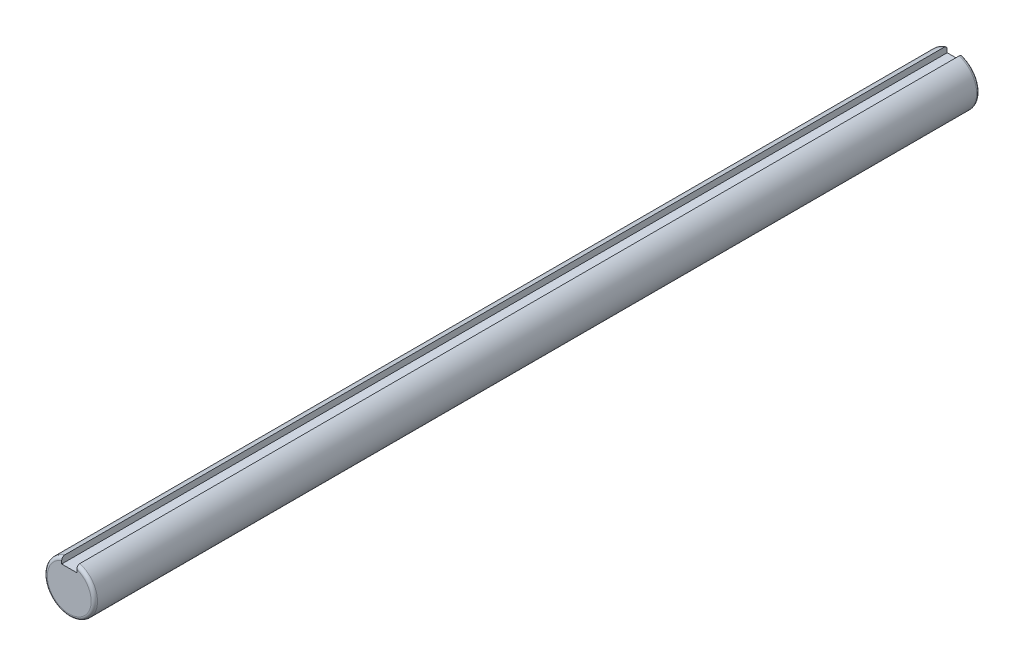
ISO-10303-21;
HEADER;
FILE_DESCRIPTION(('STEP AP214'),'2;1');
FILE_NAME('part.step','',(''),(''),'','','');
FILE_SCHEMA(('AUTOMOTIVE_DESIGN { 1 0 10303 214 1 1 1 1 }'));
ENDSEC;
DATA;
#1=APPLICATION_CONTEXT('core data for automotive mechanical design processes');
#2=APPLICATION_PROTOCOL_DEFINITION('international standard','automotive_design',2000,#1);
#3=PRODUCT_CONTEXT('',#1,'mechanical');
#4=PRODUCT('Part','Part','',(#3));
#5=PRODUCT_RELATED_PRODUCT_CATEGORY('part','',(#4));
#6=PRODUCT_DEFINITION_FORMATION('','',#4);
#7=PRODUCT_DEFINITION_CONTEXT('part definition',#1,'design');
#8=PRODUCT_DEFINITION('design','',#6,#7);
#9=PRODUCT_DEFINITION_SHAPE('','',#8);
#10=(LENGTH_UNIT() NAMED_UNIT(*) SI_UNIT(.MILLI.,.METRE.));
#11=(NAMED_UNIT(*) PLANE_ANGLE_UNIT() SI_UNIT($,.RADIAN.));
#12=(NAMED_UNIT(*) SI_UNIT($,.STERADIAN.) SOLID_ANGLE_UNIT());
#13=UNCERTAINTY_MEASURE_WITH_UNIT(LENGTH_MEASURE(1.E-05),#10,'distance_accuracy_value','');
#14=(GEOMETRIC_REPRESENTATION_CONTEXT(3) GLOBAL_UNCERTAINTY_ASSIGNED_CONTEXT((#13)) GLOBAL_UNIT_ASSIGNED_CONTEXT((#10,
#11,#12)) REPRESENTATION_CONTEXT('',''));
#15=CARTESIAN_POINT('',(0.,0.,0.));
#16=DIRECTION('',(0.,0.,1.));
#17=DIRECTION('',(1.,0.,0.));
#18=AXIS2_PLACEMENT_3D('',#15,#16,#17);
#19=CARTESIAN_POINT('',(0.,0.,140.));
#20=DIRECTION('',(0.,0.,-1.));
#21=DIRECTION('',(-1.,0.,0.));
#22=AXIS2_PLACEMENT_3D('',#19,#20,#21);
#23=CYLINDRICAL_SURFACE('',#22,3.96875);
#24=DIRECTION('',(0.,0.,-1.));
#25=VECTOR('',#24,1.);
#26=CARTESIAN_POINT('',(-1.190625,3.7859462056235,140.));
#27=LINE('',#26,#25);
#28=CARTESIAN_POINT('',(-1.190625,3.7859462056235,139.5));
#29=VERTEX_POINT('',#28);
#30=CARTESIAN_POINT('',(-1.190625,3.7859462056235,0.5));
#31=VERTEX_POINT('',#30);
#32=EDGE_CURVE('E117',#29,#31,#27,.T.);
#33=ORIENTED_EDGE('',*,*,#32,.T.);
#34=CARTESIAN_POINT('',(0.,0.,0.5));
#35=DIRECTION('',(0.,0.,1.));
#36=DIRECTION('',(1.,0.,0.));
#37=AXIS2_PLACEMENT_3D('',#34,#35,#36);
#38=CIRCLE('',#37,3.96875);
#39=CARTESIAN_POINT('',(1.190625,3.7859462056235,0.5));
#40=VERTEX_POINT('',#39);
#41=EDGE_CURVE('E127',#31,#40,#38,.T.);
#42=ORIENTED_EDGE('',*,*,#41,.T.);
#43=DIRECTION('',(0.,0.,-1.));
#44=VECTOR('',#43,1.);
#45=CARTESIAN_POINT('',(1.190625,3.7859462056235,140.));
#46=LINE('',#45,#44);
#47=CARTESIAN_POINT('',(1.190625,3.7859462056235,139.5));
#48=VERTEX_POINT('',#47);
#49=EDGE_CURVE('E121',#40,#48,#46,.F.);
#50=ORIENTED_EDGE('',*,*,#49,.T.);
#51=CARTESIAN_POINT('',(0.,0.,139.5));
#52=DIRECTION('',(0.,0.,1.));
#53=DIRECTION('',(1.,0.,0.));
#54=AXIS2_PLACEMENT_3D('',#51,#52,#53);
#55=CIRCLE('',#54,3.96875);
#56=EDGE_CURVE('E125',#48,#29,#55,.F.);
#57=ORIENTED_EDGE('',*,*,#56,.T.);
#58=EDGE_LOOP('',(#33,#42,#50,#57));
#59=FACE_BOUND('',#58,.T.);
#60=ADVANCED_FACE('F32',(#59),#23,.T.);
#61=CARTESIAN_POINT('',(0.,0.,140.));
#62=DIRECTION('',(0.,0.,1.));
#63=DIRECTION('',(1.,0.,0.));
#64=AXIS2_PLACEMENT_3D('',#61,#62,#63);
#65=PLANE('',#64);
#66=DIRECTION('',(0.,1.,0.));
#67=VECTOR('',#66,1.);
#68=CARTESIAN_POINT('',(-1.190625,3.96875,140.));
#69=LINE('',#68,#67);
#70=CARTESIAN_POINT('',(-1.190625,2.778125,140.));
#71=VERTEX_POINT('',#70);
#72=CARTESIAN_POINT('',(-1.190625,3.25801145975195,140.));
#73=VERTEX_POINT('',#72);
#74=EDGE_CURVE('E108',#71,#73,#69,.T.);
#75=ORIENTED_EDGE('',*,*,#74,.T.);
#76=CARTESIAN_POINT('',(0.,0.,140.));
#77=DIRECTION('',(0.,0.,1.));
#78=DIRECTION('',(1.,0.,0.));
#79=AXIS2_PLACEMENT_3D('',#76,#77,#78);
#80=CIRCLE('',#79,3.46875);
#81=CARTESIAN_POINT('',(1.190625,3.25801145975195,140.));
#82=VERTEX_POINT('',#81);
#83=EDGE_CURVE('E11',#73,#82,#80,.T.);
#84=ORIENTED_EDGE('',*,*,#83,.T.);
#85=DIRECTION('',(0.,-1.,0.));
#86=VECTOR('',#85,1.);
#87=CARTESIAN_POINT('',(1.190625,3.96875,140.));
#88=LINE('',#87,#86);
#89=CARTESIAN_POINT('',(1.190625,2.778125,140.));
#90=VERTEX_POINT('',#89);
#91=EDGE_CURVE('E90',#82,#90,#88,.T.);
#92=ORIENTED_EDGE('',*,*,#91,.T.);
#93=DIRECTION('',(-1.,0.,0.));
#94=VECTOR('',#93,1.);
#95=CARTESIAN_POINT('',(1.190625,2.778125,140.));
#96=LINE('',#95,#94);
#97=EDGE_CURVE('E94',#90,#71,#96,.T.);
#98=ORIENTED_EDGE('',*,*,#97,.T.);
#99=EDGE_LOOP('',(#75,#84,#92,#98));
#100=FACE_BOUND('',#99,.T.);
#101=ADVANCED_FACE('F92',(#100),#65,.T.);
#102=CARTESIAN_POINT('',(0.,0.,0.));
#103=DIRECTION('',(0.,0.,1.));
#104=DIRECTION('',(1.,0.,0.));
#105=AXIS2_PLACEMENT_3D('',#102,#103,#104);
#106=PLANE('',#105);
#107=DIRECTION('',(0.,1.,0.));
#108=VECTOR('',#107,1.);
#109=CARTESIAN_POINT('',(1.190625,0.,0.));
#110=LINE('',#109,#108);
#111=CARTESIAN_POINT('',(1.190625,2.778125,0.));
#112=VERTEX_POINT('',#111);
#113=CARTESIAN_POINT('',(1.190625,3.25801145975195,0.));
#114=VERTEX_POINT('',#113);
#115=EDGE_CURVE('E103',#112,#114,#110,.T.);
#116=ORIENTED_EDGE('',*,*,#115,.T.);
#117=CARTESIAN_POINT('',(0.,0.,0.));
#118=DIRECTION('',(0.,0.,1.));
#119=DIRECTION('',(1.,0.,0.));
#120=AXIS2_PLACEMENT_3D('',#117,#118,#119);
#121=CIRCLE('',#120,3.46875);
#122=CARTESIAN_POINT('',(-1.190625,3.25801145975195,0.));
#123=VERTEX_POINT('',#122);
#124=EDGE_CURVE('E56',#114,#123,#121,.F.);
#125=ORIENTED_EDGE('',*,*,#124,.T.);
#126=DIRECTION('',(0.,1.,0.));
#127=VECTOR('',#126,1.);
#128=CARTESIAN_POINT('',(-1.190625,3.96875,0.));
#129=LINE('',#128,#127);
#130=CARTESIAN_POINT('',(-1.190625,2.778125,0.));
#131=VERTEX_POINT('',#130);
#132=EDGE_CURVE('E97',#131,#123,#129,.T.);
#133=ORIENTED_EDGE('',*,*,#132,.F.);
#134=DIRECTION('',(-1.,0.,0.));
#135=VECTOR('',#134,1.);
#136=CARTESIAN_POINT('',(1.190625,2.778125,0.));
#137=LINE('',#136,#135);
#138=EDGE_CURVE('E114',#112,#131,#137,.T.);
#139=ORIENTED_EDGE('',*,*,#138,.F.);
#140=EDGE_LOOP('',(#116,#125,#133,#139));
#141=FACE_BOUND('',#140,.T.);
#142=ADVANCED_FACE('F148',(#141),#106,.F.);
#143=CARTESIAN_POINT('',(1.190625,3.96875,140.));
#144=DIRECTION('',(1.,0.,0.));
#145=DIRECTION('',(0.,1.,0.));
#146=AXIS2_PLACEMENT_3D('',#143,#144,#145);
#147=PLANE('',#146);
#148=ORIENTED_EDGE('',*,*,#49,.F.);
#149=CARTESIAN_POINT('',(1.190625,3.7859462056235,0.5));
#150=CARTESIAN_POINT('',(1.190625,3.78597469873176,0.472841635279006));
#151=CARTESIAN_POINT('',(1.190625,3.78362855501618,0.445697062864998));
#152=CARTESIAN_POINT('',(1.190625,3.7744051521155,0.392241759160536));
#153=CARTESIAN_POINT('',(1.190625,3.76753680609938,0.36592949410861));
#154=CARTESIAN_POINT('',(1.190625,3.74948488408156,0.314830355920039));
#155=CARTESIAN_POINT('',(1.190625,3.73830096098876,0.290043605662712));
#156=CARTESIAN_POINT('',(1.190625,3.71200275021313,0.24265264138581));
#157=CARTESIAN_POINT('',(1.190625,3.69688786184004,0.220048761654929));
#158=CARTESIAN_POINT('',(1.190625,3.66290573586547,0.17720400705749));
#159=CARTESIAN_POINT('',(1.190625,3.64397635012101,0.157012498790457));
#160=CARTESIAN_POINT('',(1.190625,3.60312304377105,0.119931609671898));
#161=CARTESIAN_POINT('',(1.190625,3.58119853810037,0.103042875553714));
#162=CARTESIAN_POINT('',(1.190625,3.53396255652632,0.0722472941472065));
#163=CARTESIAN_POINT('',(1.190625,3.50854463358824,0.0585039369932241));
#164=CARTESIAN_POINT('',(1.190625,3.45583959675433,0.0352408202070888));
#165=CARTESIAN_POINT('',(1.190625,3.42855198463452,0.0257221914486862));
#166=CARTESIAN_POINT('',(1.190625,3.3774241577984,0.0122602444725575));
#167=CARTESIAN_POINT('',(1.190625,3.35375426435924,0.00765780294128063));
#168=CARTESIAN_POINT('',(1.190625,3.30606001214181,0.00152765636510467));
#169=CARTESIAN_POINT('',(1.190625,3.28203632691435,-5.28038605039217E-06));
#170=CARTESIAN_POINT('',(1.190625,3.25801145975195,0.));
#171=B_SPLINE_CURVE_WITH_KNOTS('',3,(#149,#150,#151,#152,#153,#154,#155,#156,#157,#158,#159,
#160,#161,#162,#163,#164,#165,#166,#167,#168,#169,#170),.UNSPECIFIED.,.F.,.F.,(4,2,2,2,2,2,2,2,
2,2,4),(0.,0.081352909992497,0.162545953129706,0.243745527782305,0.324957517828655,
0.407618753958614,0.490296160242253,0.57660379286383,0.662934514368061,0.735079323221441,
0.80710106244285),.UNSPECIFIED.);
#172=EDGE_CURVE('E137',#40,#114,#171,.T.);
#173=ORIENTED_EDGE('',*,*,#172,.T.);
#174=ORIENTED_EDGE('',*,*,#115,.F.);
#175=DIRECTION('',(0.,0.,-1.));
#176=VECTOR('',#175,1.);
#177=CARTESIAN_POINT('',(1.190625,2.778125,140.));
#178=LINE('',#177,#176);
#179=EDGE_CURVE('E100',#90,#112,#178,.T.);
#180=ORIENTED_EDGE('',*,*,#179,.F.);
#181=ORIENTED_EDGE('',*,*,#91,.F.);
#182=CARTESIAN_POINT('',(1.190625,3.25801145975195,140.));
#183=CARTESIAN_POINT('',(1.190625,3.28907992168964,140.000019965846));
#184=CARTESIAN_POINT('',(1.190625,3.32015960922475,139.997446071046));
#185=CARTESIAN_POINT('',(1.190625,3.38150594471072,139.987184562257));
#186=CARTESIAN_POINT('',(1.190625,3.41177139473099,139.979489801146));
#187=CARTESIAN_POINT('',(1.190625,3.47060505161755,139.959045969103));
#188=CARTESIAN_POINT('',(1.190625,3.4991707040308,139.946289501569));
#189=CARTESIAN_POINT('',(1.190625,3.55361697804484,139.91598874355));
#190=CARTESIAN_POINT('',(1.190625,3.57949995574897,139.898448704341));
#191=CARTESIAN_POINT('',(1.190625,3.62679543148133,139.859740811631));
#192=CARTESIAN_POINT('',(1.190625,3.64833897408505,139.838733275455));
#193=CARTESIAN_POINT('',(1.190625,3.68736058817001,139.793213377799));
#194=CARTESIAN_POINT('',(1.190625,3.70483831240646,139.768700717248));
#195=CARTESIAN_POINT('',(1.190625,3.73425592210001,139.718268937998));
#196=CARTESIAN_POINT('',(1.190625,3.74643788156944,139.692490695877));
#197=CARTESIAN_POINT('',(1.190625,3.76608393875365,139.63921138492));
#198=CARTESIAN_POINT('',(1.190625,3.77355430857205,139.611712660267));
#199=CARTESIAN_POINT('',(1.190625,3.78099893838195,139.569963151131));
#200=CARTESIAN_POINT('',(1.190625,3.78285363458437,139.556024411405));
#201=CARTESIAN_POINT('',(1.190625,3.78532637941045,139.52805951352));
#202=CARTESIAN_POINT('',(1.190625,3.78594634465496,139.514033524801));
#203=CARTESIAN_POINT('',(1.190625,3.78594620562375,139.5));
#204=B_SPLINE_CURVE_WITH_KNOTS('',3,(#182,#183,#184,#185,#186,#187,#188,#189,#190,#191,#192,
#193,#194,#195,#196,#197,#198,#199,#200,#201,#202,#203),.UNSPECIFIED.,.F.,.F.,(4,2,2,2,2,2,2,2,
2,2,4),(0.,0.0931172239102765,0.1863646835369,0.279748909171464,0.37305041091707,
0.462860495660882,0.55267824790015,0.637792435916784,0.722793078799524,0.764930556360932,
0.807002574553209),.UNSPECIFIED.);
#205=EDGE_CURVE('E130',#82,#48,#204,.T.);
#206=ORIENTED_EDGE('',*,*,#205,.T.);
#207=EDGE_LOOP('',(#148,#173,#174,#180,#181,#206));
#208=FACE_BOUND('',#207,.T.);
#209=ADVANCED_FACE('F102',(#208),#147,.F.);
#210=CARTESIAN_POINT('',(-1.190625,3.96875,140.));
#211=DIRECTION('',(-1.,0.,0.));
#212=DIRECTION('',(0.,-1.,0.));
#213=AXIS2_PLACEMENT_3D('',#210,#211,#212);
#214=PLANE('',#213);
#215=ORIENTED_EDGE('',*,*,#132,.T.);
#216=CARTESIAN_POINT('',(-1.190625,3.25801145975195,0.));
#217=CARTESIAN_POINT('',(-1.190625,3.28907992168963,-1.99658462172724E-05));
#218=CARTESIAN_POINT('',(-1.190625,3.32015960922475,0.00255392895355367));
#219=CARTESIAN_POINT('',(-1.190625,3.38150594471072,0.0128154377432749));
#220=CARTESIAN_POINT('',(-1.190625,3.41177139473099,0.0205101988540044));
#221=CARTESIAN_POINT('',(-1.190625,3.47060505161755,0.0409540308972788));
#222=CARTESIAN_POINT('',(-1.190625,3.4991707040308,0.0537104984307832));
#223=CARTESIAN_POINT('',(-1.190625,3.55361697804484,0.0840112564499328));
#224=CARTESIAN_POINT('',(-1.190625,3.57949995574897,0.101551295659393));
#225=CARTESIAN_POINT('',(-1.190625,3.62679543148134,0.140259188368756));
#226=CARTESIAN_POINT('',(-1.190625,3.64833897408506,0.161266724544582));
#227=CARTESIAN_POINT('',(-1.190625,3.68736058817002,0.206786622201266));
#228=CARTESIAN_POINT('',(-1.190625,3.70483831240647,0.231299282751883));
#229=CARTESIAN_POINT('',(-1.190625,3.73425592210001,0.281731062002375));
#230=CARTESIAN_POINT('',(-1.190625,3.74643788156945,0.307509304122861));
#231=CARTESIAN_POINT('',(-1.190625,3.76608393875365,0.360788615080223));
#232=CARTESIAN_POINT('',(-1.190625,3.77355430857205,0.388287339733345));
#233=CARTESIAN_POINT('',(-1.190625,3.78099893838195,0.43003684886882));
#234=CARTESIAN_POINT('',(-1.190625,3.78285363458436,0.44397558859455));
#235=CARTESIAN_POINT('',(-1.190625,3.78532637941045,0.471940486479655));
#236=CARTESIAN_POINT('',(-1.190625,3.78594634465496,0.485966475198994));
#237=CARTESIAN_POINT('',(-1.190625,3.78594620562375,0.499999999999956));
#238=B_SPLINE_CURVE_WITH_KNOTS('',3,(#216,#217,#218,#219,#220,#221,#222,#223,#224,#225,#226,
#227,#228,#229,#230,#231,#232,#233,#234,#235,#236,#237),.UNSPECIFIED.,.F.,.F.,(4,2,2,2,2,2,2,2,
2,2,4),(0.,0.0931172239102757,0.186364683536902,0.279748909171467,0.373050410917069,
0.462860495660915,0.552678247900174,0.637792435916806,0.722793078799537,0.764930556360907,
0.80700257455319),.UNSPECIFIED.);
#239=EDGE_CURVE('E41',#123,#31,#238,.T.);
#240=ORIENTED_EDGE('',*,*,#239,.T.);
#241=ORIENTED_EDGE('',*,*,#32,.F.);
#242=CARTESIAN_POINT('',(-1.190625,3.7859462056235,139.5));
#243=CARTESIAN_POINT('',(-1.190625,3.78597469873176,139.527158364721));
#244=CARTESIAN_POINT('',(-1.190625,3.78362855501618,139.554302937135));
#245=CARTESIAN_POINT('',(-1.190625,3.7744051521155,139.607758240839));
#246=CARTESIAN_POINT('',(-1.190625,3.76753680609937,139.634070505891));
#247=CARTESIAN_POINT('',(-1.190625,3.74948488408155,139.68516964408));
#248=CARTESIAN_POINT('',(-1.190625,3.73830096098876,139.709956394337));
#249=CARTESIAN_POINT('',(-1.190625,3.71200275021313,139.757347358614));
#250=CARTESIAN_POINT('',(-1.190625,3.69688786184003,139.779951238345));
#251=CARTESIAN_POINT('',(-1.190625,3.66290573586547,139.822795992943));
#252=CARTESIAN_POINT('',(-1.190625,3.643976350121,139.84298750121));
#253=CARTESIAN_POINT('',(-1.190625,3.60312304377104,139.880068390328));
#254=CARTESIAN_POINT('',(-1.190625,3.58119853810036,139.896957124446));
#255=CARTESIAN_POINT('',(-1.190625,3.53396255652631,139.927752705853));
#256=CARTESIAN_POINT('',(-1.190625,3.50854463358822,139.941496063007));
#257=CARTESIAN_POINT('',(-1.190625,3.4558395967543,139.964759179793));
#258=CARTESIAN_POINT('',(-1.190625,3.4285519846345,139.974277808551));
#259=CARTESIAN_POINT('',(-1.190625,3.37742415779839,139.987739755527));
#260=CARTESIAN_POINT('',(-1.190625,3.35375426435923,139.992342197059));
#261=CARTESIAN_POINT('',(-1.190625,3.30606001214181,139.998472343635));
#262=CARTESIAN_POINT('',(-1.190625,3.28203632691434,140.000005280386));
#263=CARTESIAN_POINT('',(-1.190625,3.25801145975194,140.));
#264=B_SPLINE_CURVE_WITH_KNOTS('',3,(#242,#243,#244,#245,#246,#247,#248,#249,#250,#251,#252,
#253,#254,#255,#256,#257,#258,#259,#260,#261,#262,#263),.UNSPECIFIED.,.F.,.F.,(4,2,2,2,2,2,2,2,
2,2,4),(0.,0.0813529099925102,0.16254595312971,0.243745527782336,0.324957517828669,
0.407618753958613,0.490296160242259,0.576603792863857,0.662934514368086,0.735079323221447,
0.807101062442852),.UNSPECIFIED.);
#265=EDGE_CURVE('E48',#29,#73,#264,.T.);
#266=ORIENTED_EDGE('',*,*,#265,.T.);
#267=ORIENTED_EDGE('',*,*,#74,.F.);
#268=DIRECTION('',(0.,0.,-1.));
#269=VECTOR('',#268,1.);
#270=CARTESIAN_POINT('',(-1.190625,2.778125,140.));
#271=LINE('',#270,#269);
#272=EDGE_CURVE('E107',#71,#131,#271,.T.);
#273=ORIENTED_EDGE('',*,*,#272,.T.);
#274=EDGE_LOOP('',(#215,#240,#241,#266,#267,#273));
#275=FACE_BOUND('',#274,.T.);
#276=ADVANCED_FACE('F147',(#275),#214,.F.);
#277=CARTESIAN_POINT('',(1.190625,2.778125,140.));
#278=DIRECTION('',(0.,-1.,0.));
#279=DIRECTION('',(0.,0.,-1.));
#280=AXIS2_PLACEMENT_3D('',#277,#278,#279);
#281=PLANE('',#280);
#282=ORIENTED_EDGE('',*,*,#138,.T.);
#283=ORIENTED_EDGE('',*,*,#272,.F.);
#284=ORIENTED_EDGE('',*,*,#97,.F.);
#285=ORIENTED_EDGE('',*,*,#179,.T.);
#286=EDGE_LOOP('',(#282,#283,#284,#285));
#287=FACE_BOUND('',#286,.T.);
#288=ADVANCED_FACE('F110',(#287),#281,.F.);
#289=CARTESIAN_POINT('',(0.,0.,0.5));
#290=DIRECTION('',(0.,0.,1.));
#291=DIRECTION('',(1.,0.,0.));
#292=AXIS2_PLACEMENT_3D('',#289,#290,#291);
#293=TOROIDAL_SURFACE('',#292,3.46875,0.5);
#294=ORIENTED_EDGE('',*,*,#239,.F.);
#295=ORIENTED_EDGE('',*,*,#124,.F.);
#296=ORIENTED_EDGE('',*,*,#172,.F.);
#297=ORIENTED_EDGE('',*,*,#41,.F.);
#298=EDGE_LOOP('',(#294,#295,#296,#297));
#299=FACE_BOUND('',#298,.T.);
#300=ADVANCED_FACE('F157',(#299),#293,.T.);
#301=CARTESIAN_POINT('',(0.,0.,139.5));
#302=DIRECTION('',(0.,0.,1.));
#303=DIRECTION('',(1.,0.,0.));
#304=AXIS2_PLACEMENT_3D('',#301,#302,#303);
#305=TOROIDAL_SURFACE('',#304,3.46875,0.5);
#306=ORIENTED_EDGE('',*,*,#265,.F.);
#307=ORIENTED_EDGE('',*,*,#56,.F.);
#308=ORIENTED_EDGE('',*,*,#205,.F.);
#309=ORIENTED_EDGE('',*,*,#83,.F.);
#310=EDGE_LOOP('',(#306,#307,#308,#309));
#311=FACE_BOUND('',#310,.T.);
#312=ADVANCED_FACE('F34',(#311),#305,.T.);
#313=CLOSED_SHELL('',(#60,#101,#142,#209,#276,#288,#300,#312));
#314=MANIFOLD_SOLID_BREP('B2',#313);
#315=ADVANCED_BREP_SHAPE_REPRESENTATION('',(#18,#314),#14);
#316=SHAPE_DEFINITION_REPRESENTATION(#9,#315);
ENDSEC;
END-ISO-10303-21;
